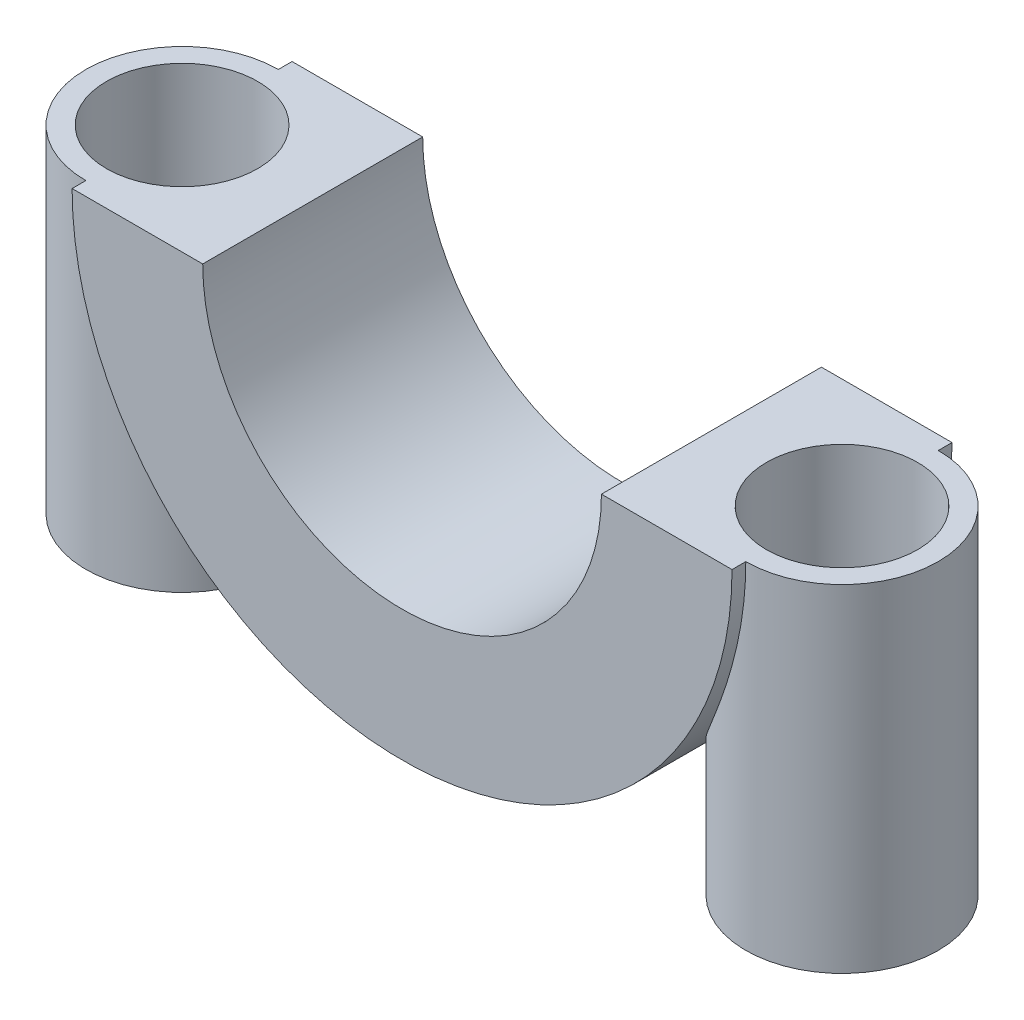
ISO-10303-21;
HEADER;
FILE_DESCRIPTION(('STEP AP214'),'2;1');
FILE_NAME('part.step','',(''),(''),'','','');
FILE_SCHEMA(('AUTOMOTIVE_DESIGN { 1 0 10303 214 1 1 1 1 }'));
ENDSEC;
DATA;
#1=APPLICATION_CONTEXT('core data for automotive mechanical design processes');
#2=APPLICATION_PROTOCOL_DEFINITION('international standard','automotive_design',2000,#1);
#3=PRODUCT_CONTEXT('',#1,'mechanical');
#4=PRODUCT('Part','Part','',(#3));
#5=PRODUCT_RELATED_PRODUCT_CATEGORY('part','',(#4));
#6=PRODUCT_DEFINITION_FORMATION('','',#4);
#7=PRODUCT_DEFINITION_CONTEXT('part definition',#1,'design');
#8=PRODUCT_DEFINITION('design','',#6,#7);
#9=PRODUCT_DEFINITION_SHAPE('','',#8);
#10=(LENGTH_UNIT() NAMED_UNIT(*) SI_UNIT(.MILLI.,.METRE.));
#11=(NAMED_UNIT(*) PLANE_ANGLE_UNIT() SI_UNIT($,.RADIAN.));
#12=(NAMED_UNIT(*) SI_UNIT($,.STERADIAN.) SOLID_ANGLE_UNIT());
#13=UNCERTAINTY_MEASURE_WITH_UNIT(LENGTH_MEASURE(1.E-05),#10,'distance_accuracy_value','');
#14=(GEOMETRIC_REPRESENTATION_CONTEXT(3) GLOBAL_UNCERTAINTY_ASSIGNED_CONTEXT((#13)) GLOBAL_UNIT_ASSIGNED_CONTEXT((#10,
#11,#12)) REPRESENTATION_CONTEXT('',''));
#15=CARTESIAN_POINT('',(0.,0.,0.));
#16=DIRECTION('',(0.,0.,1.));
#17=DIRECTION('',(1.,0.,0.));
#18=AXIS2_PLACEMENT_3D('',#15,#16,#17);
#19=CARTESIAN_POINT('',(0.,-33.5045720551894,-10.01));
#20=DIRECTION('',(0.,0.,1.));
#21=DIRECTION('',(1.,0.,0.));
#22=AXIS2_PLACEMENT_3D('',#19,#20,#21);
#23=CYLINDRICAL_SURFACE('',#22,14.5);
#24=DIRECTION('',(0.,0.,1.));
#25=VECTOR('',#24,1.);
#26=CARTESIAN_POINT('',(-14.5,-33.5045720551894,-10.01));
#27=LINE('',#26,#25);
#28=CARTESIAN_POINT('',(-14.5,-33.5045720551894,8.));
#29=VERTEX_POINT('',#28);
#30=CARTESIAN_POINT('',(-14.5,-33.5045720551894,-8.));
#31=VERTEX_POINT('',#30);
#32=EDGE_CURVE('E260',#29,#31,#27,.F.);
#33=ORIENTED_EDGE('',*,*,#32,.F.);
#34=CARTESIAN_POINT('',(0.,-33.5045720551894,8.));
#35=DIRECTION('',(0.,0.,1.));
#36=DIRECTION('',(1.,0.,0.));
#37=AXIS2_PLACEMENT_3D('',#34,#35,#36);
#38=CIRCLE('',#37,14.5);
#39=CARTESIAN_POINT('',(14.5,-33.5045720551894,8.));
#40=VERTEX_POINT('',#39);
#41=EDGE_CURVE('E51',#29,#40,#38,.T.);
#42=ORIENTED_EDGE('',*,*,#41,.T.);
#43=DIRECTION('',(0.,0.,1.));
#44=VECTOR('',#43,1.);
#45=CARTESIAN_POINT('',(14.5,-33.5045720551894,-10.01));
#46=LINE('',#45,#44);
#47=CARTESIAN_POINT('',(14.5,-33.5045720551894,-8.));
#48=VERTEX_POINT('',#47);
#49=EDGE_CURVE('E59',#48,#40,#46,.T.);
#50=ORIENTED_EDGE('',*,*,#49,.F.);
#51=CARTESIAN_POINT('',(0.,-33.5045720551894,-8.));
#52=DIRECTION('',(0.,0.,1.));
#53=DIRECTION('',(1.,0.,0.));
#54=AXIS2_PLACEMENT_3D('',#51,#52,#53);
#55=CIRCLE('',#54,14.5);
#56=EDGE_CURVE('E38',#31,#48,#55,.T.);
#57=ORIENTED_EDGE('',*,*,#56,.F.);
#58=EDGE_LOOP('',(#33,#42,#50,#57));
#59=FACE_BOUND('',#58,.T.);
#60=ADVANCED_FACE('F34',(#59),#23,.F.);
#61=CARTESIAN_POINT('',(68.0905858561066,-33.5045720551894,-10.01));
#62=DIRECTION('',(0.,1.,0.));
#63=DIRECTION('',(0.,0.,1.));
#64=AXIS2_PLACEMENT_3D('',#61,#62,#63);
#65=PLANE('',#64);
#66=DIRECTION('',(0.,0.,-1.));
#67=VECTOR('',#66,1.);
#68=CARTESIAN_POINT('',(24.,-33.5045720551894,6.));
#69=LINE('',#68,#67);
#70=CARTESIAN_POINT('',(24.,-33.5045720551894,-7.));
#71=VERTEX_POINT('',#70);
#72=CARTESIAN_POINT('',(24.,-33.5045720551894,-8.));
#73=VERTEX_POINT('',#72);
#74=EDGE_CURVE('E268',#71,#73,#69,.T.);
#75=ORIENTED_EDGE('',*,*,#74,.T.);
#76=DIRECTION('',(-1.,0.,0.));
#77=VECTOR('',#76,1.);
#78=CARTESIAN_POINT('',(0.,-33.5045720551894,-8.));
#79=LINE('',#78,#77);
#80=EDGE_CURVE('E112',#73,#48,#79,.T.);
#81=ORIENTED_EDGE('',*,*,#80,.T.);
#82=ORIENTED_EDGE('',*,*,#49,.T.);
#83=DIRECTION('',(-1.,0.,0.));
#84=VECTOR('',#83,1.);
#85=CARTESIAN_POINT('',(0.,-33.5045720551894,8.));
#86=LINE('',#85,#84);
#87=CARTESIAN_POINT('',(24.,-33.5045720551894,8.));
#88=VERTEX_POINT('',#87);
#89=EDGE_CURVE('E265',#88,#40,#86,.T.);
#90=ORIENTED_EDGE('',*,*,#89,.F.);
#91=CARTESIAN_POINT('',(24.,-33.5045720551894,7.));
#92=VERTEX_POINT('',#91);
#93=EDGE_CURVE('E271',#88,#92,#69,.T.);
#94=ORIENTED_EDGE('',*,*,#93,.T.);
#95=CARTESIAN_POINT('',(24.,-33.5045720551894,0.));
#96=DIRECTION('',(0.,1.,0.));
#97=DIRECTION('',(0.,0.,1.));
#98=AXIS2_PLACEMENT_3D('',#95,#96,#97);
#99=CIRCLE('',#98,7.);
#100=EDGE_CURVE('E104',#71,#92,#99,.F.);
#101=ORIENTED_EDGE('',*,*,#100,.F.);
#102=EDGE_LOOP('',(#75,#81,#82,#90,#94,#101));
#103=FACE_BOUND('',#102,.T.);
#104=CARTESIAN_POINT('',(24.0000000000001,-33.5045720551894,0.));
#105=DIRECTION('',(0.,1.,0.));
#106=DIRECTION('',(0.,0.,1.));
#107=AXIS2_PLACEMENT_3D('',#104,#105,#106);
#108=CIRCLE('',#107,5.49999999999999);
#109=CARTESIAN_POINT('',(24.0000000000001,-33.5045720551894,5.49999999999999));
#110=VERTEX_POINT('',#109);
#111=EDGE_CURVE('E43',#110,#110,#108,.F.);
#112=ORIENTED_EDGE('',*,*,#111,.T.);
#113=EDGE_LOOP('',(#112));
#114=FACE_BOUND('',#113,.T.);
#115=ADVANCED_FACE('F36',(#103,#114),#65,.T.);
#116=ORIENTED_EDGE('',*,*,#32,.T.);
#117=DIRECTION('',(-1.,0.,0.));
#118=VECTOR('',#117,1.);
#119=CARTESIAN_POINT('',(0.,-33.5045720551894,-8.));
#120=LINE('',#119,#118);
#121=CARTESIAN_POINT('',(-24.,-33.5045720551894,-8.));
#122=VERTEX_POINT('',#121);
#123=EDGE_CURVE('E256',#31,#122,#120,.T.);
#124=ORIENTED_EDGE('',*,*,#123,.T.);
#125=DIRECTION('',(0.,0.,-1.));
#126=VECTOR('',#125,1.);
#127=CARTESIAN_POINT('',(-24.,-33.5045720551894,6.));
#128=LINE('',#127,#126);
#129=CARTESIAN_POINT('',(-24.,-33.5045720551894,-7.));
#130=VERTEX_POINT('',#129);
#131=EDGE_CURVE('E100',#122,#130,#128,.F.);
#132=ORIENTED_EDGE('',*,*,#131,.T.);
#133=CARTESIAN_POINT('',(-24.,-33.5045720551894,0.));
#134=DIRECTION('',(0.,1.,0.));
#135=DIRECTION('',(0.,0.,1.));
#136=AXIS2_PLACEMENT_3D('',#133,#134,#135);
#137=CIRCLE('',#136,7.);
#138=CARTESIAN_POINT('',(-24.,-33.5045720551894,7.));
#139=VERTEX_POINT('',#138);
#140=EDGE_CURVE('E90',#139,#130,#137,.F.);
#141=ORIENTED_EDGE('',*,*,#140,.F.);
#142=CARTESIAN_POINT('',(-24.,-33.5045720551894,8.));
#143=VERTEX_POINT('',#142);
#144=EDGE_CURVE('E96',#139,#143,#128,.F.);
#145=ORIENTED_EDGE('',*,*,#144,.T.);
#146=DIRECTION('',(-1.,0.,0.));
#147=VECTOR('',#146,1.);
#148=CARTESIAN_POINT('',(0.,-33.5045720551894,8.));
#149=LINE('',#148,#147);
#150=EDGE_CURVE('E263',#29,#143,#149,.T.);
#151=ORIENTED_EDGE('',*,*,#150,.F.);
#152=EDGE_LOOP('',(#116,#124,#132,#141,#145,#151));
#153=FACE_BOUND('',#152,.T.);
#154=CARTESIAN_POINT('',(-23.9999999999999,-33.5045720551894,0.));
#155=DIRECTION('',(0.,1.,0.));
#156=DIRECTION('',(0.,0.,1.));
#157=AXIS2_PLACEMENT_3D('',#154,#155,#156);
#158=CIRCLE('',#157,5.49999999999999);
#159=CARTESIAN_POINT('',(-23.9999999999999,-33.5045720551894,5.49999999999999));
#160=VERTEX_POINT('',#159);
#161=EDGE_CURVE('E11',#160,#160,#158,.F.);
#162=ORIENTED_EDGE('',*,*,#161,.T.);
#163=EDGE_LOOP('',(#162));
#164=FACE_BOUND('',#163,.T.);
#165=ADVANCED_FACE('F93',(#153,#164),#65,.T.);
#166=CARTESIAN_POINT('',(0.,-33.5045720551894,6.));
#167=DIRECTION('',(0.,0.,-1.));
#168=DIRECTION('',(-1.,0.,0.));
#169=AXIS2_PLACEMENT_3D('',#166,#167,#168);
#170=CYLINDRICAL_SURFACE('',#169,24.);
#171=ORIENTED_EDGE('',*,*,#93,.F.);
#172=CARTESIAN_POINT('',(0.,-33.5045720551894,8.));
#173=DIRECTION('',(0.,0.,1.));
#174=DIRECTION('',(1.,0.,0.));
#175=AXIS2_PLACEMENT_3D('',#172,#173,#174);
#176=CIRCLE('',#175,24.);
#177=EDGE_CURVE('E111',#143,#88,#176,.T.);
#178=ORIENTED_EDGE('',*,*,#177,.F.);
#179=ORIENTED_EDGE('',*,*,#144,.F.);
#180=CARTESIAN_POINT('',(-20.48501104995,-20.9999999999999,6.05349920963297));
#181=CARTESIAN_POINT('',(-20.5928069786459,-21.1765702105775,6.11606916988713));
#182=CARTESIAN_POINT('',(-20.6990206260703,-21.3557237680055,6.17391573540019));
#183=CARTESIAN_POINT('',(-20.9077518270184,-21.718582006521,6.28106886840099));
#184=CARTESIAN_POINT('',(-21.0102708684071,-21.9022848041295,6.33037890478888));
#185=CARTESIAN_POINT('',(-21.2109498621231,-22.2733637335947,6.42131550342098));
#186=CARTESIAN_POINT('',(-21.3091188726562,-22.4607309357927,6.46295866264716));
#187=CARTESIAN_POINT('',(-21.5009915152111,-22.8390960830072,6.53954285870693));
#188=CARTESIAN_POINT('',(-21.5946946456306,-23.0300944325153,6.57448314400861));
#189=CARTESIAN_POINT('',(-21.8677354408025,-23.6059904674955,6.67012760444947));
#190=CARTESIAN_POINT('',(-22.040044714058,-23.9957097779366,6.72210690357115));
#191=CARTESIAN_POINT('',(-22.364331117936,-24.7856695962197,6.80828432774452));
#192=CARTESIAN_POINT('',(-22.5162926433393,-25.1859179007471,6.84246886288714));
#193=CARTESIAN_POINT('',(-22.7642621623256,-25.8958188367786,6.89091682144171));
#194=CARTESIAN_POINT('',(-22.8648657275829,-26.2036907639751,6.9080075307533));
#195=CARTESIAN_POINT('',(-23.0536024363487,-26.8235263877348,6.93638574656437));
#196=CARTESIAN_POINT('',(-23.1417344687705,-27.1354904461634,6.94767273624714));
#197=CARTESIAN_POINT('',(-23.3053249829484,-27.7628870372343,6.96593124184068));
#198=CARTESIAN_POINT('',(-23.3807816985671,-28.0783200467156,6.97290215672652));
#199=CARTESIAN_POINT('',(-23.5188571911826,-28.7120241335772,6.98378818973639));
#200=CARTESIAN_POINT('',(-23.5814762975746,-29.0302951379197,6.98770338627315));
#201=CARTESIAN_POINT('',(-23.6939394550133,-29.670114626701,6.99353324353314));
#202=CARTESIAN_POINT('',(-23.743743513017,-29.991670191715,6.99544169748955));
#203=CARTESIAN_POINT('',(-23.8302384123403,-30.6365457913624,6.99807496559805));
#204=CARTESIAN_POINT('',(-23.8669291847407,-30.9598658352604,6.99879977352934));
#205=CARTESIAN_POINT('',(-23.9271320787432,-31.607689826822,6.99968547472375));
#206=CARTESIAN_POINT('',(-23.9506458678757,-31.9321936194502,6.99984643935405));
#207=CARTESIAN_POINT('',(-23.9844630282016,-32.581888343164,7.0000031721472));
#208=CARTESIAN_POINT('',(-23.9947664074147,-32.9070792738325,6.99999894041032));
#209=CARTESIAN_POINT('',(-24.0021943731572,-33.5619035382904,7.0000007307831));
#210=CARTESIAN_POINT('',(-23.9991432947853,-33.8915388783675,7.00000688891119));
#211=CARTESIAN_POINT('',(-23.9794673890811,-34.5504055830689,6.99997677169291));
#212=CARTESIAN_POINT('',(-23.9628424932232,-34.8796369456454,6.99994049613233));
#213=CARTESIAN_POINT('',(-23.9160427362462,-35.5371968787451,6.99953560879866));
#214=CARTESIAN_POINT('',(-23.885865350965,-35.8655252696225,6.99916693510325));
#215=CARTESIAN_POINT('',(-23.8120116069861,-36.5206564735208,6.99757274481885));
#216=CARTESIAN_POINT('',(-23.7683353395779,-36.8474592968437,6.99634723402436));
#217=CARTESIAN_POINT('',(-23.6676086880768,-37.4986606423031,6.99228532468586));
#218=CARTESIAN_POINT('',(-23.6105714583563,-37.8230612075523,6.98945050668298));
#219=CARTESIAN_POINT('',(-23.4832005487151,-38.4692202036565,6.98118837723473));
#220=CARTESIAN_POINT('',(-23.4128664876294,-38.7909785584944,6.97576099146436));
#221=CARTESIAN_POINT('',(-23.2590686514383,-39.4311254821778,6.96110536226372));
#222=CARTESIAN_POINT('',(-23.1756101346476,-39.7495153463178,6.95187863865266));
#223=CARTESIAN_POINT('',(-22.9957371306631,-40.3823834941312,6.92818004916296));
#224=CARTESIAN_POINT('',(-22.8993239218764,-40.6968621604317,6.9137087006004));
#225=CARTESIAN_POINT('',(-22.6698165171485,-41.3940355025879,6.87365966754721));
#226=CARTESIAN_POINT('',(-22.5334103203482,-41.7755471014082,6.8462795815678));
#227=CARTESIAN_POINT('',(-22.241930219974,-42.5300960622184,6.77728718243238));
#228=CARTESIAN_POINT('',(-22.0868565588875,-42.903133534211,6.73567505413541));
#229=CARTESIAN_POINT('',(-21.759345148829,-43.6383068110001,6.63391580631849));
#230=CARTESIAN_POINT('',(-21.5869335503396,-44.0004579946893,6.57379632693272));
#231=CARTESIAN_POINT('',(-21.2262493761805,-44.7119431954643,6.4299311635697));
#232=CARTESIAN_POINT('',(-21.0379830023884,-45.0612821482255,6.34619468796792));
#233=CARTESIAN_POINT('',(-20.7125998437282,-45.6313061033655,6.18177501577739));
#234=CARTESIAN_POINT('',(-20.5791033255479,-45.8564074897362,6.10920129868672));
#235=CARTESIAN_POINT('',(-20.3073972046929,-46.2981949467843,5.9489132011806));
#236=CARTESIAN_POINT('',(-20.169188934782,-46.514883360662,5.86120307419195));
#237=CARTESIAN_POINT('',(-19.8897217750144,-46.9382330833888,5.66871890776686));
#238=CARTESIAN_POINT('',(-19.748465721629,-47.1449031796477,5.56396018707216));
#239=CARTESIAN_POINT('',(-19.4648740633835,-47.5466176884009,5.33533347281929));
#240=CARTESIAN_POINT('',(-19.3225388393175,-47.7416660044983,5.21147194637751));
#241=CARTESIAN_POINT('',(-19.077968282518,-48.0668722208323,4.97933547731546));
#242=CARTESIAN_POINT('',(-18.9753494562367,-48.2002574238062,4.87597524534268));
#243=CARTESIAN_POINT('',(-18.7722022562029,-48.4588839834851,4.65750806928441));
#244=CARTESIAN_POINT('',(-18.6716744191454,-48.5841232664993,4.54239815311812));
#245=CARTESIAN_POINT('',(-18.4743157178575,-48.8252744077417,4.30013937399979));
#246=CARTESIAN_POINT('',(-18.3774814831198,-48.9411948820862,4.17300187410744));
#247=CARTESIAN_POINT('',(-18.189138440904,-49.162680411412,3.90646717210861));
#248=CARTESIAN_POINT('',(-18.0976263208168,-49.2682519364965,3.76707773458419));
#249=CARTESIAN_POINT('',(-17.938335416978,-49.4490943347969,3.50360421976545));
#250=CARTESIAN_POINT('',(-17.8693374889259,-49.5263230752084,3.38159812170068));
#251=CARTESIAN_POINT('',(-17.7370909320664,-49.672605984849,3.12988277954949));
#252=CARTESIAN_POINT('',(-17.6738395320339,-49.7416640992182,3.00017729887353));
#253=CARTESIAN_POINT('',(-17.5540908261617,-49.8710522503542,2.73342864130153));
#254=CARTESIAN_POINT('',(-17.4975954016828,-49.9313798568839,2.59638343579782));
#255=CARTESIAN_POINT('',(-17.3924338766802,-50.0426828331015,2.3157105866916));
#256=CARTESIAN_POINT('',(-17.3437644103239,-50.0936622246546,2.1720858072041));
#257=CARTESIAN_POINT('',(-17.2548882098124,-50.1860880891128,1.87808572283757));
#258=CARTESIAN_POINT('',(-17.2147408618868,-50.2274678413149,1.72767137192814));
#259=CARTESIAN_POINT('',(-17.1441854671544,-50.299793482272,1.42210784309629));
#260=CARTESIAN_POINT('',(-17.1137775756213,-50.3307392046804,1.26695858972975));
#261=CARTESIAN_POINT('',(-17.0633954443957,-50.3818297221345,0.953278849241187));
#262=CARTESIAN_POINT('',(-17.0434173023715,-50.4019785569529,0.794749649880119));
#263=CARTESIAN_POINT('',(-17.0143456330124,-50.4312514072207,0.475693436520412));
#264=CARTESIAN_POINT('',(-17.0052509221164,-50.4403766214778,0.315166641676838));
#265=CARTESIAN_POINT('',(-16.9985481734191,-50.4471034809083,0.0114440685130155));
#266=CARTESIAN_POINT('',(-16.9997798349732,-50.4458691378721,-0.131702739079807));
#267=CARTESIAN_POINT('',(-17.0109890023856,-50.4346139348797,-0.417306803985798));
#268=CARTESIAN_POINT('',(-17.0209662951014,-50.4245932890572,-0.559764078018727));
#269=CARTESIAN_POINT('',(-17.0494771214179,-50.3958638008999,-0.842895320402591));
#270=CARTESIAN_POINT('',(-17.0680085755546,-50.3771570700926,-0.983569713626486));
#271=CARTESIAN_POINT('',(-17.1132857810546,-50.3312320779595,-1.26217611826016));
#272=CARTESIAN_POINT('',(-17.1400316687694,-50.3040136753484,-1.40010808410793));
#273=CARTESIAN_POINT('',(-17.200696653587,-50.2418920422854,-1.66979487139999));
#274=CARTESIAN_POINT('',(-17.2344733232957,-50.2071409027786,-1.80161683698558));
#275=CARTESIAN_POINT('',(-17.3089266338547,-50.129972233659,-2.06101378301205));
#276=CARTESIAN_POINT('',(-17.3496055245701,-50.0875522039798,-2.18858736236596));
#277=CARTESIAN_POINT('',(-17.4810530800938,-49.9492964473882,-2.56386773256527));
#278=CARTESIAN_POINT('',(-17.5812796387709,-49.8424178108455,-2.80433725398109));
#279=CARTESIAN_POINT('',(-17.8113005229822,-49.5914926267788,-3.28282407118058));
#280=CARTESIAN_POINT('',(-17.9429620175671,-49.4449387118965,-3.51860023671388));
#281=CARTESIAN_POINT('',(-18.2222495228991,-49.1249004821146,-3.96055627905758));
#282=CARTESIAN_POINT('',(-18.3698848352046,-48.9514004506046,-4.16671874741763));
#283=CARTESIAN_POINT('',(-18.6412024158236,-48.6221360319602,-4.50776163402795));
#284=CARTESIAN_POINT('',(-18.7630949188097,-48.470743966842,-4.64838603191856));
#285=CARTESIAN_POINT('',(-19.0099789734244,-48.1558762128576,-4.91247074933685));
#286=CARTESIAN_POINT('',(-19.1349719059558,-47.9923950729944,-5.03592325283581));
#287=CARTESIAN_POINT('',(-19.3859774516117,-47.6547737727611,-5.26687243823411));
#288=CARTESIAN_POINT('',(-19.511991441981,-47.4806158791408,-5.37434150005133));
#289=CARTESIAN_POINT('',(-19.7630649452471,-47.1232731263007,-5.57441911264571));
#290=CARTESIAN_POINT('',(-19.88812411784,-46.940085207646,-5.66702258099279));
#291=CARTESIAN_POINT('',(-20.2040428951951,-46.4628696487066,-5.88603392354037));
#292=CARTESIAN_POINT('',(-20.3932116506119,-46.1633585574861,-6.00297361440832));
#293=CARTESIAN_POINT('',(-20.7618151423402,-45.5493029127597,-6.20957492528214));
#294=CARTESIAN_POINT('',(-20.9412442358057,-45.2347498387772,-6.29922086789878));
#295=CARTESIAN_POINT('',(-21.2880777929783,-44.5929034602807,-6.45614176293276));
#296=CARTESIAN_POINT('',(-21.4554575150485,-44.2655859563524,-6.52337165998574));
#297=CARTESIAN_POINT('',(-21.7760814367619,-43.6010277957048,-6.63952236969344));
#298=CARTESIAN_POINT('',(-21.9293265400118,-43.2637877751389,-6.68844435336006));
#299=CARTESIAN_POINT('',(-22.1930353544596,-42.6456760040839,-6.76386981629627));
#300=CARTESIAN_POINT('',(-22.3061085006664,-42.3662074275954,-6.79286341392963));
#301=CARTESIAN_POINT('',(-22.5218640388501,-41.802565991009,-6.84305392929689));
#302=CARTESIAN_POINT('',(-22.6245451883484,-41.5183925731102,-6.86424991553629));
#303=CARTESIAN_POINT('',(-22.8192543506857,-40.9458828370147,-6.90040915232789));
#304=CARTESIAN_POINT('',(-22.9112770624959,-40.6575445268856,-6.91536931098993));
#305=CARTESIAN_POINT('',(-23.0843967979659,-40.0774141721438,-6.94041203566975));
#306=CARTESIAN_POINT('',(-23.1654941941584,-39.7856222456621,-6.95049476802899));
#307=CARTESIAN_POINT('',(-23.3166383940846,-39.1989696670011,-6.96697908754924));
#308=CARTESIAN_POINT('',(-23.3866808466051,-38.9041078549512,-6.97337922785533));
#309=CARTESIAN_POINT('',(-23.5155571005031,-38.3119003944696,-6.9835157877004));
#310=CARTESIAN_POINT('',(-23.5743908371351,-38.0145547317005,-6.98725219185302));
#311=CARTESIAN_POINT('',(-23.6807454584552,-37.4178959556148,-6.99291869679424));
#312=CARTESIAN_POINT('',(-23.7282687229597,-37.1185832698198,-6.99484917781489));
#313=CARTESIAN_POINT('',(-23.8119477102713,-36.5183675276591,-6.9975987521179));
#314=CARTESIAN_POINT('',(-23.8481033641123,-36.217464461656,-6.99841783865763));
#315=CARTESIAN_POINT('',(-23.9101523214032,-35.6030356517039,-6.99949490604727));
#316=CARTESIAN_POINT('',(-23.9356030170142,-35.289465088768,-6.99973036152991));
#317=CARTESIAN_POINT('',(-23.9741591399262,-34.6615644825713,-6.99997881872454));
#318=CARTESIAN_POINT('',(-23.9872644848695,-34.3472344342579,-6.99999181895251));
#319=CARTESIAN_POINT('',(-24.0011102352296,-33.7182674395963,-7.00000335471709));
#320=CARTESIAN_POINT('',(-24.0018492850452,-33.4036304633831,-7.00000188866794));
#321=CARTESIAN_POINT('',(-23.990957841892,-32.774571966365,-6.99999626356779));
#322=CARTESIAN_POINT('',(-23.9793273944828,-32.4601504447708,-6.99999210452672));
#323=CARTESIAN_POINT('',(-23.9436978331354,-31.8317058408193,-6.99979628263085));
#324=CARTESIAN_POINT('',(-23.9196868552665,-31.5176834307938,-6.99960443976516));
#325=CARTESIAN_POINT('',(-23.8593268511052,-30.8908249358654,-6.99865134651067));
#326=CARTESIAN_POINT('',(-23.8229777010154,-30.5779888628976,-6.99789009040847));
#327=CARTESIAN_POINT('',(-23.7380044034082,-29.9540431388445,-6.99522476315042));
#328=CARTESIAN_POINT('',(-23.689382339658,-29.6429332038402,-6.99332088591996));
#329=CARTESIAN_POINT('',(-23.5799441751468,-29.0229039581007,-6.98759883558611));
#330=CARTESIAN_POINT('',(-23.5191284582325,-28.7139845787253,-6.98378072273569));
#331=CARTESIAN_POINT('',(-23.3409366413612,-27.8942924808515,-6.96980761756183));
#332=CARTESIAN_POINT('',(-23.2128364218228,-27.3858502158119,-6.95712736045555));
#333=CARTESIAN_POINT('',(-22.9237183589202,-26.3787360338171,-6.91830315361852));
#334=CARTESIAN_POINT('',(-22.7626939356397,-25.8800660917291,-6.89215651103585));
#335=CARTESIAN_POINT('',(-22.497794093633,-25.1429266583501,-6.83749884423269));
#336=CARTESIAN_POINT('',(-22.4058267721577,-24.8995450038618,-6.81676875270078));
#337=CARTESIAN_POINT('',(-22.2142563016846,-24.4164313152027,-6.76911221130328));
#338=CARTESIAN_POINT('',(-22.1146540332674,-24.1766988639605,-6.74218647530057));
#339=CARTESIAN_POINT('',(-21.9081609414645,-23.7015340888558,-6.68100238897219));
#340=CARTESIAN_POINT('',(-21.8012751022586,-23.4660989614463,-6.64674901931416));
#341=CARTESIAN_POINT('',(-21.5805473161208,-22.9999810231758,-6.56962097485336));
#342=CARTESIAN_POINT('',(-21.4667068649218,-22.769297204619,-6.52674814933021));
#343=CARTESIAN_POINT('',(-21.2816422981849,-22.4089022956931,-6.45104013474494));
#344=CARTESIAN_POINT('',(-21.2125510551216,-22.2773882664173,-6.42152752877682));
#345=CARTESIAN_POINT('',(-21.0723273800776,-22.0163633593628,-6.35882401160614));
#346=CARTESIAN_POINT('',(-21.0011952833746,-21.8868521578728,-6.32563370205297));
#347=CARTESIAN_POINT('',(-20.7846763856387,-21.501052945263,-6.21992398171452));
#348=CARTESIAN_POINT('',(-20.6364316847193,-21.2480139223141,-6.14137114323296));
#349=CARTESIAN_POINT('',(-20.48501104995,-20.9999999999999,-6.05349920963297));
#350=B_SPLINE_CURVE_WITH_KNOTS('',3,(#180,#181,#182,#183,#184,#185,#186,#187,#188,#189,#190,
#191,#192,#193,#194,#195,#196,#197,#198,#199,#200,#201,#202,#203,#204,#205,#206,#207,#208,#209,
#210,#211,#212,#213,#214,#215,#216,#217,#218,#219,#220,#221,#222,#223,#224,#225,#226,#227,#228,
#229,#230,#231,#232,#233,#234,#235,#236,#237,#238,#239,#240,#241,#242,#243,#244,#245,#246,#247,
#248,#249,#250,#251,#252,#253,#254,#255,#256,#257,#258,#259,#260,#261,#262,#263,#264,#265,#266,
#267,#268,#269,#270,#271,#272,#273,#274,#275,#276,#277,#278,#279,#280,#281,#282,#283,#284,#285,
#286,#287,#288,#289,#290,#291,#292,#293,#294,#295,#296,#297,#298,#299,#300,#301,#302,#303,#304,
#305,#306,#307,#308,#309,#310,#311,#312,#313,#314,#315,#316,#317,#318,#319,#320,#321,#322,#323,
#324,#325,#326,#327,#328,#329,#330,#331,#332,#333,#334,#335,#336,#337,#338,#339,#340,#341,#342,
#343,#344,#345,#346,#347,#348,#349),.UNSPECIFIED.,.F.,.F.,(4,2,2,2,2,2,2,2,2,2,2,2,2,2,2,2,2,2,
2,2,2,2,2,2,2,2,2,2,2,2,2,2,2,2,2,2,2,2,2,2,2,2,2,2,2,2,2,2,2,2,2,2,2,2,2,2,2,2,2,2,2,2,2,2,2,2,
2,2,2,2,2,2,2,2,2,2,2,2,2,2,2,2,2,2,4),(0.,0.648248882365476,1.29623372110662,1.94279889431159,
2.58943651863778,3.87603911482297,5.16362285662173,6.1363384582752,7.10914066449913,
8.08207830557395,9.05499097929125,10.030904056449,11.0068222626208,11.9826169396865,
12.9584110243727,13.9470790311828,14.9357520291867,15.9246092447639,16.9134597731079,
17.9013408024641,18.8892501545748,19.876764704401,20.8641818748768,22.0817261629063,
23.2992546369361,24.514973521111,25.7302190446478,26.5444763880288,27.3585052914287,
28.1718067601084,28.984833493426,29.5768662977878,30.1690492296201,30.7606781798604,
31.3519348559855,31.8315775834137,32.310987764713,32.7905311397133,33.2698677151131,
33.752442192504,34.2350243630705,34.7174258439803,35.1997748594881,35.6287188275668,
36.0576523420083,36.4864816402098,36.9153180569321,37.3361911015013,37.7572015993708,
38.5985883757709,39.5170250546625,40.4359994473865,41.154744146424,41.8738149291128,
42.5941142093933,43.3146592322717,44.4320123133451,45.5500059907241,46.6702334322097,
47.7903892093867,48.6986745622283,49.6070683826802,50.5159120748606,51.4247247693314,
52.3338942841698,53.2430690505441,54.1520523496105,55.0610411632877,56.0046015753851,
56.9481682820781,57.8918384224976,58.8355050871936,59.780077727647,60.7246598459342,
61.6690816952921,62.6134738196554,64.185665459988,65.7581716111463,66.5410074492547,
67.3237531340517,68.1059684595358,68.8880161417059,69.3423388283316,69.7965873000242,
70.7068451378506),.UNSPECIFIED.);
#351=EDGE_CURVE('E105',#139,#130,#350,.T.);
#352=ORIENTED_EDGE('',*,*,#351,.T.);
#353=ORIENTED_EDGE('',*,*,#131,.F.);
#354=CARTESIAN_POINT('',(0.,-33.5045720551894,-8.));
#355=DIRECTION('',(0.,0.,1.));
#356=DIRECTION('',(1.,0.,0.));
#357=AXIS2_PLACEMENT_3D('',#354,#355,#356);
#358=CIRCLE('',#357,24.);
#359=EDGE_CURVE('E274',#122,#73,#358,.T.);
#360=ORIENTED_EDGE('',*,*,#359,.T.);
#361=ORIENTED_EDGE('',*,*,#74,.F.);
#362=CARTESIAN_POINT('',(20.4850110499502,-21.0000000000001,-6.05349920963297));
#363=CARTESIAN_POINT('',(20.5928069786461,-21.1765702105778,-6.11606916988713));
#364=CARTESIAN_POINT('',(20.6990206260704,-21.3557237680058,-6.17391573540019));
#365=CARTESIAN_POINT('',(20.9077518270186,-21.7185820065213,-6.28106886840099));
#366=CARTESIAN_POINT('',(21.0102708684072,-21.9022848041298,-6.33037890478888));
#367=CARTESIAN_POINT('',(21.2109498621233,-22.273363733595,-6.42131550342098));
#368=CARTESIAN_POINT('',(21.3091188726563,-22.460730935793,-6.46295866264716));
#369=CARTESIAN_POINT('',(21.5009915152113,-22.8390960830075,-6.53954285870693));
#370=CARTESIAN_POINT('',(21.5946946456308,-23.0300944325156,-6.57448314400861));
#371=CARTESIAN_POINT('',(21.8677354408026,-23.6059904674958,-6.67012760444948));
#372=CARTESIAN_POINT('',(22.0400447140581,-23.9957097779369,-6.72210690357116));
#373=CARTESIAN_POINT('',(22.3643311179362,-24.78566959622,-6.80828432774452));
#374=CARTESIAN_POINT('',(22.5162926433394,-25.1859179007474,-6.84246886288714));
#375=CARTESIAN_POINT('',(22.7642621623257,-25.8958188367789,-6.89091682144171));
#376=CARTESIAN_POINT('',(22.864865727583,-26.2036907639754,-6.9080075307533));
#377=CARTESIAN_POINT('',(23.0536024363488,-26.8235263877351,-6.93638574656437));
#378=CARTESIAN_POINT('',(23.1417344687706,-27.1354904461637,-6.94767273624714));
#379=CARTESIAN_POINT('',(23.3053249829484,-27.7628870372346,-6.96593124184068));
#380=CARTESIAN_POINT('',(23.3807816985672,-28.0783200467159,-6.97290215672652));
#381=CARTESIAN_POINT('',(23.5188571911827,-28.7120241335775,-6.98378818973639));
#382=CARTESIAN_POINT('',(23.5814762975747,-29.03029513792,-6.98770338627315));
#383=CARTESIAN_POINT('',(23.6939394550134,-29.6701146267013,-6.99353324353314));
#384=CARTESIAN_POINT('',(23.743743513017,-29.9916701917153,-6.99544169748955));
#385=CARTESIAN_POINT('',(23.8302384123403,-30.6365457913627,-6.99807496559805));
#386=CARTESIAN_POINT('',(23.8669291847407,-30.9598658352607,-6.99879977352934));
#387=CARTESIAN_POINT('',(23.9271320787432,-31.6076898268223,-6.99968547472375));
#388=CARTESIAN_POINT('',(23.9506458678757,-31.9321936194505,-6.99984643935405));
#389=CARTESIAN_POINT('',(23.9844630282016,-32.5818883431644,-7.0000031721472));
#390=CARTESIAN_POINT('',(23.9947664074147,-32.9070792738328,-6.99999894041032));
#391=CARTESIAN_POINT('',(24.0021943731572,-33.5619035382907,-7.0000007307831));
#392=CARTESIAN_POINT('',(23.9991432947853,-33.8915388783678,-7.00000688891119));
#393=CARTESIAN_POINT('',(23.9794673890811,-34.5504055830692,-6.99997677169291));
#394=CARTESIAN_POINT('',(23.9628424932232,-34.8796369456457,-6.99994049613233));
#395=CARTESIAN_POINT('',(23.9160427362462,-35.5371968787455,-6.99953560879866));
#396=CARTESIAN_POINT('',(23.8858653509649,-35.8655252696228,-6.99916693510325));
#397=CARTESIAN_POINT('',(23.8120116069861,-36.5206564735212,-6.99757274481885));
#398=CARTESIAN_POINT('',(23.7683353395778,-36.847459296844,-6.99634723402436));
#399=CARTESIAN_POINT('',(23.6676086880767,-37.4986606423035,-6.99228532468586));
#400=CARTESIAN_POINT('',(23.6105714583562,-37.8230612075526,-6.98945050668298));
#401=CARTESIAN_POINT('',(23.4832005487151,-38.4692202036568,-6.98118837723473));
#402=CARTESIAN_POINT('',(23.4128664876293,-38.7909785584947,-6.97576099146436));
#403=CARTESIAN_POINT('',(23.2590686514382,-39.4311254821781,-6.96110536226372));
#404=CARTESIAN_POINT('',(23.1756101346475,-39.7495153463181,-6.95187863865266));
#405=CARTESIAN_POINT('',(22.9957371306631,-40.3823834941315,-6.92818004916296));
#406=CARTESIAN_POINT('',(22.8993239218763,-40.696862160432,-6.9137087006004));
#407=CARTESIAN_POINT('',(22.6698165171484,-41.3940355025882,-6.87365966754722));
#408=CARTESIAN_POINT('',(22.5334103203481,-41.7755471014085,-6.84627958156781));
#409=CARTESIAN_POINT('',(22.2419302199739,-42.5300960622187,-6.77728718243239));
#410=CARTESIAN_POINT('',(22.0868565588873,-42.9031335342113,-6.73567505413541));
#411=CARTESIAN_POINT('',(21.7593451488289,-43.6383068110004,-6.6339158063185));
#412=CARTESIAN_POINT('',(21.5869335503395,-44.0004579946896,-6.57379632693273));
#413=CARTESIAN_POINT('',(21.2262493761804,-44.7119431954646,-6.4299311635697));
#414=CARTESIAN_POINT('',(21.0379830023882,-45.0612821482258,-6.34619468796793));
#415=CARTESIAN_POINT('',(20.7125998437281,-45.6313061033658,-6.18177501577739));
#416=CARTESIAN_POINT('',(20.5791033255477,-45.8564074897365,-6.10920129868673));
#417=CARTESIAN_POINT('',(20.3073972046927,-46.2981949467846,-5.9489132011806));
#418=CARTESIAN_POINT('',(20.1691889347818,-46.5148833606623,-5.86120307419195));
#419=CARTESIAN_POINT('',(19.8897217750142,-46.9382330833891,-5.66871890776686));
#420=CARTESIAN_POINT('',(19.7484657216288,-47.144903179648,-5.56396018707217));
#421=CARTESIAN_POINT('',(19.4648740633833,-47.5466176884012,-5.33533347281929));
#422=CARTESIAN_POINT('',(19.3225388393173,-47.7416660044986,-5.21147194637752));
#423=CARTESIAN_POINT('',(19.0779682825178,-48.0668722208326,-4.97933547731547));
#424=CARTESIAN_POINT('',(18.9753494562365,-48.2002574238065,-4.87597524534269));
#425=CARTESIAN_POINT('',(18.7722022562027,-48.4588839834853,-4.65750806928442));
#426=CARTESIAN_POINT('',(18.6716744191452,-48.5841232664995,-4.54239815311813));
#427=CARTESIAN_POINT('',(18.4743157178573,-48.8252744077419,-4.3001393739998));
#428=CARTESIAN_POINT('',(18.3774814831196,-48.9411948820865,-4.17300187410745));
#429=CARTESIAN_POINT('',(18.1891384409038,-49.1626804114122,-3.90646717210862));
#430=CARTESIAN_POINT('',(18.0976263208165,-49.2682519364968,-3.76707773458419));
#431=CARTESIAN_POINT('',(17.9383354169778,-49.4490943347971,-3.50360421976545));
#432=CARTESIAN_POINT('',(17.8693374889256,-49.5263230752086,-3.38159812170068));
#433=CARTESIAN_POINT('',(17.7370909320662,-49.6726059848493,-3.12988277954949));
#434=CARTESIAN_POINT('',(17.6738395320337,-49.7416640992184,-3.00017729887353));
#435=CARTESIAN_POINT('',(17.5540908261615,-49.8710522503544,-2.73342864130153));
#436=CARTESIAN_POINT('',(17.4975954016825,-49.9313798568841,-2.59638343579782));
#437=CARTESIAN_POINT('',(17.3924338766799,-50.0426828331018,-2.3157105866916));
#438=CARTESIAN_POINT('',(17.3437644103237,-50.0936622246549,-2.1720858072041));
#439=CARTESIAN_POINT('',(17.2548882098121,-50.186088089113,-1.87808572283757));
#440=CARTESIAN_POINT('',(17.2147408618865,-50.2274678413152,-1.72767137192814));
#441=CARTESIAN_POINT('',(17.1441854671542,-50.2997934822723,-1.42210784309629));
#442=CARTESIAN_POINT('',(17.1137775756211,-50.3307392046807,-1.26695858972975));
#443=CARTESIAN_POINT('',(17.0633954443955,-50.3818297221348,-0.953278849241183));
#444=CARTESIAN_POINT('',(17.0434173023712,-50.4019785569531,-0.794749649880115));
#445=CARTESIAN_POINT('',(17.0143456330122,-50.4312514072209,-0.47569343652041));
#446=CARTESIAN_POINT('',(17.0052509221162,-50.4403766214781,-0.315166641676837));
#447=CARTESIAN_POINT('',(16.9985481734188,-50.4471034809085,-0.0114440685130128));
#448=CARTESIAN_POINT('',(16.999779834973,-50.4458691378723,0.131702739079812));
#449=CARTESIAN_POINT('',(17.0109890023854,-50.4346139348799,0.417306803985806));
#450=CARTESIAN_POINT('',(17.0209662951011,-50.4245932890574,0.559764078018736));
#451=CARTESIAN_POINT('',(17.0494771214177,-50.3958638009002,0.842895320402599));
#452=CARTESIAN_POINT('',(17.0680085755543,-50.3771570700928,0.983569713626495));
#453=CARTESIAN_POINT('',(17.1132857810544,-50.3312320779597,1.26217611826017));
#454=CARTESIAN_POINT('',(17.1400316687692,-50.3040136753486,1.40010808410794));
#455=CARTESIAN_POINT('',(17.2006966535867,-50.2418920422857,1.6697948714));
#456=CARTESIAN_POINT('',(17.2344733232955,-50.2071409027788,1.80161683698558));
#457=CARTESIAN_POINT('',(17.3089266338545,-50.1299722336593,2.06101378301206));
#458=CARTESIAN_POINT('',(17.3496055245699,-50.0875522039801,2.18858736236596));
#459=CARTESIAN_POINT('',(17.4810530800936,-49.9492964473884,2.56386773256528));
#460=CARTESIAN_POINT('',(17.5812796387707,-49.8424178108457,2.80433725398109));
#461=CARTESIAN_POINT('',(17.811300522982,-49.5914926267791,3.28282407118058));
#462=CARTESIAN_POINT('',(17.9429620175668,-49.4449387118968,3.51860023671388));
#463=CARTESIAN_POINT('',(18.2222495228989,-49.1249004821149,3.96055627905759));
#464=CARTESIAN_POINT('',(18.3698848352043,-48.9514004506049,4.16671874741764));
#465=CARTESIAN_POINT('',(18.6412024158234,-48.6221360319605,4.50776163402795));
#466=CARTESIAN_POINT('',(18.7630949188095,-48.4707439668422,4.64838603191856));
#467=CARTESIAN_POINT('',(19.0099789734242,-48.1558762128579,4.91247074933685));
#468=CARTESIAN_POINT('',(19.1349719059555,-47.9923950729947,5.03592325283582));
#469=CARTESIAN_POINT('',(19.3859774516115,-47.6547737727614,5.26687243823411));
#470=CARTESIAN_POINT('',(19.5119914419808,-47.4806158791411,5.37434150005133));
#471=CARTESIAN_POINT('',(19.7630649452469,-47.123273126301,5.57441911264571));
#472=CARTESIAN_POINT('',(19.8881241178398,-46.9400852076463,5.6670225809928));
#473=CARTESIAN_POINT('',(20.2040428951949,-46.4628696487069,5.88603392354037));
#474=CARTESIAN_POINT('',(20.3932116506117,-46.1633585574864,6.00297361440832));
#475=CARTESIAN_POINT('',(20.7618151423401,-45.54930291276,6.20957492528214));
#476=CARTESIAN_POINT('',(20.9412442358055,-45.2347498387775,6.29922086789878));
#477=CARTESIAN_POINT('',(21.2880777929782,-44.592903460281,6.45614176293277));
#478=CARTESIAN_POINT('',(21.4554575150484,-44.2655859563527,6.52337165998574));
#479=CARTESIAN_POINT('',(21.7760814367617,-43.6010277957051,6.63952236969344));
#480=CARTESIAN_POINT('',(21.9293265400116,-43.2637877751392,6.68844435336006));
#481=CARTESIAN_POINT('',(22.1930353544595,-42.6456760040842,6.76386981629627));
#482=CARTESIAN_POINT('',(22.3061085006663,-42.3662074275957,6.79286341392964));
#483=CARTESIAN_POINT('',(22.5218640388499,-41.8025659910093,6.84305392929689));
#484=CARTESIAN_POINT('',(22.6245451883483,-41.5183925731105,6.8642499155363));
#485=CARTESIAN_POINT('',(22.8192543506856,-40.945882837015,6.9004091523279));
#486=CARTESIAN_POINT('',(22.9112770624958,-40.6575445268859,6.91536931098994));
#487=CARTESIAN_POINT('',(23.0843967979658,-40.0774141721441,6.94041203566975));
#488=CARTESIAN_POINT('',(23.1654941941583,-39.7856222456624,6.95049476802899));
#489=CARTESIAN_POINT('',(23.3166383940846,-39.1989696670014,6.96697908754924));
#490=CARTESIAN_POINT('',(23.386680846605,-38.9041078549515,6.97337922785533));
#491=CARTESIAN_POINT('',(23.5155571005031,-38.3119003944699,6.9835157877004));
#492=CARTESIAN_POINT('',(23.5743908371351,-38.0145547317008,6.98725219185302));
#493=CARTESIAN_POINT('',(23.6807454584552,-37.4178959556151,6.99291869679424));
#494=CARTESIAN_POINT('',(23.7282687229596,-37.1185832698201,6.99484917781489));
#495=CARTESIAN_POINT('',(23.8119477102713,-36.5183675276595,6.9975987521179));
#496=CARTESIAN_POINT('',(23.8481033641122,-36.2174644616563,6.99841783865763));
#497=CARTESIAN_POINT('',(23.9101523214032,-35.6030356517042,6.99949490604727));
#498=CARTESIAN_POINT('',(23.9356030170142,-35.2894650887684,6.99973036152991));
#499=CARTESIAN_POINT('',(23.9741591399262,-34.6615644825717,6.99997881872454));
#500=CARTESIAN_POINT('',(23.9872644848695,-34.3472344342582,6.99999181895251));
#501=CARTESIAN_POINT('',(24.0011102352296,-33.7182674395966,7.00000335471709));
#502=CARTESIAN_POINT('',(24.0018492850452,-33.4036304633834,7.00000188866794));
#503=CARTESIAN_POINT('',(23.990957841892,-32.7745719663653,6.99999626356779));
#504=CARTESIAN_POINT('',(23.9793273944828,-32.4601504447711,6.99999210452672));
#505=CARTESIAN_POINT('',(23.9436978331355,-31.8317058408197,6.99979628263085));
#506=CARTESIAN_POINT('',(23.9196868552666,-31.5176834307942,6.99960443976516));
#507=CARTESIAN_POINT('',(23.8593268511053,-30.8908249358657,6.99865134651067));
#508=CARTESIAN_POINT('',(23.8229777010154,-30.5779888628979,6.99789009040847));
#509=CARTESIAN_POINT('',(23.7380044034083,-29.9540431388448,6.99522476315042));
#510=CARTESIAN_POINT('',(23.6893823396581,-29.6429332038405,6.99332088591996));
#511=CARTESIAN_POINT('',(23.5799441751469,-29.022903958101,6.98759883558611));
#512=CARTESIAN_POINT('',(23.5191284582326,-28.7139845787256,6.98378072273569));
#513=CARTESIAN_POINT('',(23.3409366413613,-27.8942924808518,6.96980761756183));
#514=CARTESIAN_POINT('',(23.2128364218228,-27.3858502158122,6.95712736045555));
#515=CARTESIAN_POINT('',(22.9237183589203,-26.3787360338174,6.91830315361852));
#516=CARTESIAN_POINT('',(22.7626939356398,-25.8800660917294,6.89215651103585));
#517=CARTESIAN_POINT('',(22.4977940936331,-25.1429266583504,6.83749884423269));
#518=CARTESIAN_POINT('',(22.4058267721578,-24.8995450038621,6.81676875270078));
#519=CARTESIAN_POINT('',(22.2142563016847,-24.416431315203,6.76911221130327));
#520=CARTESIAN_POINT('',(22.1146540332675,-24.1766988639608,6.74218647530057));
#521=CARTESIAN_POINT('',(21.9081609414646,-23.7015340888561,6.68100238897219));
#522=CARTESIAN_POINT('',(21.8012751022588,-23.4660989614465,6.64674901931416));
#523=CARTESIAN_POINT('',(21.580547316121,-22.9999810231761,6.56962097485336));
#524=CARTESIAN_POINT('',(21.466706864922,-22.7692972046193,6.52674814933021));
#525=CARTESIAN_POINT('',(21.2816422981851,-22.4089022956934,6.45104013474494));
#526=CARTESIAN_POINT('',(21.2125510551218,-22.2773882664176,6.42152752877682));
#527=CARTESIAN_POINT('',(21.0723273800777,-22.0163633593631,6.35882401160614));
#528=CARTESIAN_POINT('',(21.0011952833748,-21.8868521578731,6.32563370205297));
#529=CARTESIAN_POINT('',(20.7846763856389,-21.5010529452632,6.21992398171453));
#530=CARTESIAN_POINT('',(20.6364316847195,-21.2480139223144,6.14137114323297));
#531=CARTESIAN_POINT('',(20.4850110499502,-21.0000000000001,6.05349920963297));
#532=B_SPLINE_CURVE_WITH_KNOTS('',3,(#362,#363,#364,#365,#366,#367,#368,#369,#370,#371,#372,
#373,#374,#375,#376,#377,#378,#379,#380,#381,#382,#383,#384,#385,#386,#387,#388,#389,#390,#391,
#392,#393,#394,#395,#396,#397,#398,#399,#400,#401,#402,#403,#404,#405,#406,#407,#408,#409,#410,
#411,#412,#413,#414,#415,#416,#417,#418,#419,#420,#421,#422,#423,#424,#425,#426,#427,#428,#429,
#430,#431,#432,#433,#434,#435,#436,#437,#438,#439,#440,#441,#442,#443,#444,#445,#446,#447,#448,
#449,#450,#451,#452,#453,#454,#455,#456,#457,#458,#459,#460,#461,#462,#463,#464,#465,#466,#467,
#468,#469,#470,#471,#472,#473,#474,#475,#476,#477,#478,#479,#480,#481,#482,#483,#484,#485,#486,
#487,#488,#489,#490,#491,#492,#493,#494,#495,#496,#497,#498,#499,#500,#501,#502,#503,#504,#505,
#506,#507,#508,#509,#510,#511,#512,#513,#514,#515,#516,#517,#518,#519,#520,#521,#522,#523,#524,
#525,#526,#527,#528,#529,#530,#531),.UNSPECIFIED.,.F.,.F.,(4,2,2,2,2,2,2,2,2,2,2,2,2,2,2,2,2,2,
2,2,2,2,2,2,2,2,2,2,2,2,2,2,2,2,2,2,2,2,2,2,2,2,2,2,2,2,2,2,2,2,2,2,2,2,2,2,2,2,2,2,2,2,2,2,2,2,
2,2,2,2,2,2,2,2,2,2,2,2,2,2,2,2,2,2,4),(0.,0.648248882365472,1.29623372110661,1.94279889431158,
2.58943651863777,3.87603911482296,5.16362285662172,6.13633845827519,7.10914066449912,
8.08207830557394,9.05499097929125,10.030904056449,11.0068222626208,11.9826169396865,
12.9584110243727,13.9470790311828,14.9357520291867,15.9246092447639,16.9134597731079,
17.9013408024641,18.8892501545748,19.8767647044009,20.8641818748768,22.0817261629063,
23.299254636936,24.514973521111,25.7302190446478,26.5444763880288,27.3585052914287,
28.1718067601084,28.984833493426,29.5768662977878,30.1690492296201,30.7606781798604,
31.3519348559855,31.8315775834137,32.3109877647131,32.7905311397133,33.2698677151131,
33.752442192504,34.2350243630705,34.7174258439803,35.1997748594881,35.6287188275668,
36.0576523420083,36.4864816402099,36.9153180569321,37.3361911015013,37.7572015993708,
38.598588375771,39.5170250546625,40.4359994473865,41.154744146424,41.8738149291128,
42.5941142093933,43.3146592322718,44.4320123133451,45.5500059907241,46.6702334322097,
47.7903892093867,48.6986745622283,49.6070683826803,50.5159120748606,51.4247247693314,
52.3338942841699,53.2430690505441,54.1520523496105,55.0610411632878,56.0046015753851,
56.9481682820781,57.8918384224976,58.8355050871937,59.7800777276471,60.7246598459343,
61.6690816952922,62.6134738196554,64.185665459988,65.7581716111464,66.5410074492547,
67.3237531340518,68.1059684595358,68.888016141706,69.3423388283317,69.7965873000242,
70.7068451378506),.UNSPECIFIED.);
#533=EDGE_CURVE('E115',#71,#92,#532,.T.);
#534=ORIENTED_EDGE('',*,*,#533,.T.);
#535=EDGE_LOOP('',(#171,#178,#179,#352,#353,#360,#361,#534));
#536=FACE_BOUND('',#535,.T.);
#537=ADVANCED_FACE('F109',(#536),#170,.T.);
#538=CARTESIAN_POINT('',(0.,-33.5045720551894,-8.));
#539=DIRECTION('',(0.,0.,1.));
#540=DIRECTION('',(1.,0.,0.));
#541=AXIS2_PLACEMENT_3D('',#538,#539,#540);
#542=PLANE('',#541);
#543=ORIENTED_EDGE('',*,*,#80,.F.);
#544=ORIENTED_EDGE('',*,*,#359,.F.);
#545=ORIENTED_EDGE('',*,*,#123,.F.);
#546=ORIENTED_EDGE('',*,*,#56,.T.);
#547=EDGE_LOOP('',(#543,#544,#545,#546));
#548=FACE_BOUND('',#547,.T.);
#549=ADVANCED_FACE('F155',(#548),#542,.F.);
#550=CARTESIAN_POINT('',(0.,-33.5045720551894,8.));
#551=DIRECTION('',(0.,0.,1.));
#552=DIRECTION('',(1.,0.,0.));
#553=AXIS2_PLACEMENT_3D('',#550,#551,#552);
#554=PLANE('',#553);
#555=ORIENTED_EDGE('',*,*,#177,.T.);
#556=ORIENTED_EDGE('',*,*,#89,.T.);
#557=ORIENTED_EDGE('',*,*,#41,.F.);
#558=ORIENTED_EDGE('',*,*,#150,.T.);
#559=EDGE_LOOP('',(#555,#556,#557,#558));
#560=FACE_BOUND('',#559,.T.);
#561=ADVANCED_FACE('F152',(#560),#554,.T.);
#562=CARTESIAN_POINT('',(24.0000000000001,-21.0000000000002,0.));
#563=DIRECTION('',(0.,-1.,0.));
#564=DIRECTION('',(1.,0.,0.));
#565=AXIS2_PLACEMENT_3D('',#562,#563,#564);
#566=CYLINDRICAL_SURFACE('',#565,7.);
#567=CARTESIAN_POINT('',(23.9999999999998,-58.0000000000002,0.));
#568=DIRECTION('',(0.,-1.,0.));
#569=DIRECTION('',(1.,0.,0.));
#570=AXIS2_PLACEMENT_3D('',#567,#568,#569);
#571=CIRCLE('',#570,7.);
#572=CARTESIAN_POINT('',(30.9999999999998,-58.0000000000002,0.));
#573=VERTEX_POINT('',#572);
#574=EDGE_CURVE('E278',#573,#573,#571,.T.);
#575=ORIENTED_EDGE('',*,*,#574,.F.);
#576=EDGE_LOOP('',(#575));
#577=FACE_BOUND('',#576,.T.);
#578=ORIENTED_EDGE('',*,*,#533,.F.);
#579=ORIENTED_EDGE('',*,*,#100,.T.);
#580=EDGE_LOOP('',(#578,#579));
#581=FACE_BOUND('',#580,.T.);
#582=ADVANCED_FACE('F141',(#577,#581),#566,.T.);
#583=CARTESIAN_POINT('',(-23.9999999999999,-20.9999999999998,0.));
#584=DIRECTION('',(0.,-1.,0.));
#585=DIRECTION('',(1.,0.,0.));
#586=AXIS2_PLACEMENT_3D('',#583,#584,#585);
#587=CYLINDRICAL_SURFACE('',#586,7.);
#588=CARTESIAN_POINT('',(-24.0000000000002,-57.9999999999998,0.));
#589=DIRECTION('',(0.,-1.,0.));
#590=DIRECTION('',(1.,0.,0.));
#591=AXIS2_PLACEMENT_3D('',#588,#589,#590);
#592=CIRCLE('',#591,7.);
#593=CARTESIAN_POINT('',(-17.0000000000002,-57.9999999999999,0.));
#594=VERTEX_POINT('',#593);
#595=EDGE_CURVE('E281',#594,#594,#592,.T.);
#596=ORIENTED_EDGE('',*,*,#595,.F.);
#597=EDGE_LOOP('',(#596));
#598=FACE_BOUND('',#597,.T.);
#599=ORIENTED_EDGE('',*,*,#351,.F.);
#600=ORIENTED_EDGE('',*,*,#140,.T.);
#601=EDGE_LOOP('',(#599,#600));
#602=FACE_BOUND('',#601,.T.);
#603=ADVANCED_FACE('F114',(#598,#602),#587,.T.);
#604=CARTESIAN_POINT('',(24.0000000000001,-21.0000000000002,0.));
#605=DIRECTION('',(0.,1.,0.));
#606=DIRECTION('',(0.,0.,1.));
#607=AXIS2_PLACEMENT_3D('',#604,#605,#606);
#608=CYLINDRICAL_SURFACE('',#607,5.49999999999999);
#609=CARTESIAN_POINT('',(24.0000000000001,-58.0000000000002,0.));
#610=DIRECTION('',(0.,-1.,0.));
#611=DIRECTION('',(1.,0.,0.));
#612=AXIS2_PLACEMENT_3D('',#609,#610,#611);
#613=CIRCLE('',#612,5.49999999999999);
#614=CARTESIAN_POINT('',(29.5000000000001,-58.0000000000002,0.));
#615=VERTEX_POINT('',#614);
#616=EDGE_CURVE('E132',#615,#615,#613,.T.);
#617=ORIENTED_EDGE('',*,*,#616,.T.);
#618=EDGE_LOOP('',(#617));
#619=FACE_BOUND('',#618,.T.);
#620=ORIENTED_EDGE('',*,*,#111,.F.);
#621=EDGE_LOOP('',(#620));
#622=FACE_BOUND('',#621,.T.);
#623=ADVANCED_FACE('F140',(#619,#622),#608,.F.);
#624=CARTESIAN_POINT('',(-23.9999999999999,-20.9999999999998,0.));
#625=DIRECTION('',(0.,1.,0.));
#626=DIRECTION('',(0.,0.,1.));
#627=AXIS2_PLACEMENT_3D('',#624,#625,#626);
#628=CYLINDRICAL_SURFACE('',#627,5.49999999999999);
#629=CARTESIAN_POINT('',(-23.9999999999999,-57.9999999999998,0.));
#630=DIRECTION('',(0.,-1.,0.));
#631=DIRECTION('',(1.,0.,0.));
#632=AXIS2_PLACEMENT_3D('',#629,#630,#631);
#633=CIRCLE('',#632,5.49999999999999);
#634=CARTESIAN_POINT('',(-18.4999999999999,-57.9999999999999,0.));
#635=VERTEX_POINT('',#634);
#636=EDGE_CURVE('E261',#635,#635,#633,.T.);
#637=ORIENTED_EDGE('',*,*,#636,.T.);
#638=EDGE_LOOP('',(#637));
#639=FACE_BOUND('',#638,.T.);
#640=ORIENTED_EDGE('',*,*,#161,.F.);
#641=EDGE_LOOP('',(#640));
#642=FACE_BOUND('',#641,.T.);
#643=ADVANCED_FACE('F147',(#639,#642),#628,.F.);
#644=CARTESIAN_POINT('',(23.9999999999998,-58.0000000000002,0.));
#645=DIRECTION('',(0.,-1.,0.));
#646=DIRECTION('',(1.,0.,0.));
#647=AXIS2_PLACEMENT_3D('',#644,#645,#646);
#648=PLANE('',#647);
#649=ORIENTED_EDGE('',*,*,#616,.F.);
#650=EDGE_LOOP('',(#649));
#651=FACE_BOUND('',#650,.T.);
#652=ORIENTED_EDGE('',*,*,#574,.T.);
#653=EDGE_LOOP('',(#652));
#654=FACE_BOUND('',#653,.T.);
#655=ADVANCED_FACE('F145',(#651,#654),#648,.T.);
#656=CARTESIAN_POINT('',(-24.0000000000002,-57.9999999999998,0.));
#657=DIRECTION('',(0.,-1.,0.));
#658=DIRECTION('',(1.,0.,0.));
#659=AXIS2_PLACEMENT_3D('',#656,#657,#658);
#660=PLANE('',#659);
#661=ORIENTED_EDGE('',*,*,#636,.F.);
#662=EDGE_LOOP('',(#661));
#663=FACE_BOUND('',#662,.T.);
#664=ORIENTED_EDGE('',*,*,#595,.T.);
#665=EDGE_LOOP('',(#664));
#666=FACE_BOUND('',#665,.T.);
#667=ADVANCED_FACE('F143',(#663,#666),#660,.T.);
#668=CLOSED_SHELL('',(#60,#115,#165,#537,#549,#561,#582,#603,#623,#643,#655,#667));
#669=MANIFOLD_SOLID_BREP('B2',#668);
#670=ADVANCED_BREP_SHAPE_REPRESENTATION('',(#18,#669),#14);
#671=SHAPE_DEFINITION_REPRESENTATION(#9,#670);
ENDSEC;
END-ISO-10303-21;
